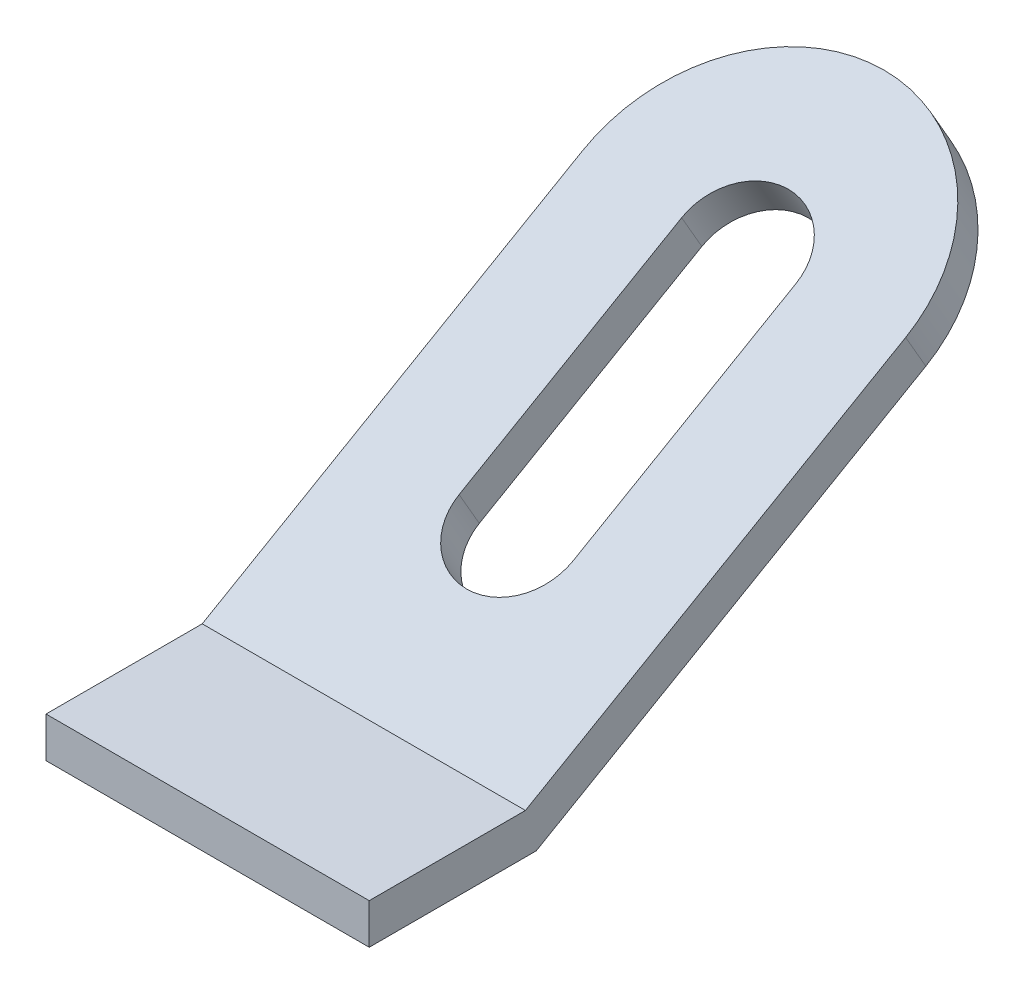
ISO-10303-21;
HEADER;
FILE_DESCRIPTION(('STEP AP214'),'2;1');
FILE_NAME('part.step','',(''),(''),'','','');
FILE_SCHEMA(('AUTOMOTIVE_DESIGN { 1 0 10303 214 1 1 1 1 }'));
ENDSEC;
DATA;
#1=APPLICATION_CONTEXT('core data for automotive mechanical design processes');
#2=APPLICATION_PROTOCOL_DEFINITION('international standard','automotive_design',2000,#1);
#3=PRODUCT_CONTEXT('',#1,'mechanical');
#4=PRODUCT('Part','Part','',(#3));
#5=PRODUCT_RELATED_PRODUCT_CATEGORY('part','',(#4));
#6=PRODUCT_DEFINITION_FORMATION('','',#4);
#7=PRODUCT_DEFINITION_CONTEXT('part definition',#1,'design');
#8=PRODUCT_DEFINITION('design','',#6,#7);
#9=PRODUCT_DEFINITION_SHAPE('','',#8);
#10=(LENGTH_UNIT() NAMED_UNIT(*) SI_UNIT(.MILLI.,.METRE.));
#11=(NAMED_UNIT(*) PLANE_ANGLE_UNIT() SI_UNIT($,.RADIAN.));
#12=(NAMED_UNIT(*) SI_UNIT($,.STERADIAN.) SOLID_ANGLE_UNIT());
#13=UNCERTAINTY_MEASURE_WITH_UNIT(LENGTH_MEASURE(1.E-05),#10,'distance_accuracy_value','');
#14=(GEOMETRIC_REPRESENTATION_CONTEXT(3) GLOBAL_UNCERTAINTY_ASSIGNED_CONTEXT((#13)) GLOBAL_UNIT_ASSIGNED_CONTEXT((#10,
#11,#12)) REPRESENTATION_CONTEXT('',''));
#15=CARTESIAN_POINT('',(0.,0.,0.));
#16=DIRECTION('',(0.,0.,1.));
#17=DIRECTION('',(1.,0.,0.));
#18=AXIS2_PLACEMENT_3D('',#15,#16,#17);
#19=CARTESIAN_POINT('',(2.,1.76674682452695,-3.31009526419165));
#20=DIRECTION('',(0.,0.866025403784439,0.5));
#21=DIRECTION('',(0.,-0.5,0.866025403784439));
#22=AXIS2_PLACEMENT_3D('',#19,#20,#21);
#23=PLANE('',#22);
#24=DIRECTION('',(0.,0.5,-0.866025403784439));
#25=VECTOR('',#24,1.);
#26=CARTESIAN_POINT('',(0.646584863990501,0.452920877533672,-1.034481971697));
#27=LINE('',#26,#25);
#28=CARTESIAN_POINT('',(0.646584863990501,0.452920877533672,-1.034481971697));
#29=VERTEX_POINT('',#28);
#30=CARTESIAN_POINT('',(0.646584863990501,1.24794660594162,-2.41150692662403));
#31=VERTEX_POINT('',#30);
#32=EDGE_CURVE('E134',#29,#31,#27,.T.);
#33=ORIENTED_EDGE('',*,*,#32,.F.);
#34=CARTESIAN_POINT('',(0.999999999999999,0.452920877533672,-1.034481971697));
#35=DIRECTION('',(0.,0.866025403784439,0.5));
#36=DIRECTION('',(0.,-0.5,0.866025403784439));
#37=AXIS2_PLACEMENT_3D('',#34,#35,#36);
#38=CIRCLE('',#37,0.353415136009498);
#39=CARTESIAN_POINT('',(1.3534151360095,0.452920877533672,-1.034481971697));
#40=VERTEX_POINT('',#39);
#41=EDGE_CURVE('E118',#40,#29,#38,.F.);
#42=ORIENTED_EDGE('',*,*,#41,.F.);
#43=DIRECTION('',(0.,-0.5,0.866025403784439));
#44=VECTOR('',#43,1.);
#45=CARTESIAN_POINT('',(1.3534151360095,0.452920877533672,-1.034481971697));
#46=LINE('',#45,#44);
#47=CARTESIAN_POINT('',(1.3534151360095,1.24794660594162,-2.41150692662403));
#48=VERTEX_POINT('',#47);
#49=EDGE_CURVE('E127',#48,#40,#46,.T.);
#50=ORIENTED_EDGE('',*,*,#49,.F.);
#51=CARTESIAN_POINT('',(0.999999999999997,1.24794660594162,-2.41150692662403));
#52=DIRECTION('',(0.,0.866025403784439,0.5));
#53=DIRECTION('',(0.,-0.5,0.866025403784439));
#54=AXIS2_PLACEMENT_3D('',#51,#52,#53);
#55=CIRCLE('',#54,0.353415136009498);
#56=EDGE_CURVE('E49',#31,#48,#55,.F.);
#57=ORIENTED_EDGE('',*,*,#56,.F.);
#58=EDGE_LOOP('',(#33,#42,#50,#57));
#59=FACE_BOUND('',#58,.T.);
#60=DIRECTION('',(0.,0.5,-0.866025403784439));
#61=VECTOR('',#60,1.);
#62=CARTESIAN_POINT('',(0.,1.76674682452695,-3.31009526419165));
#63=LINE('',#62,#61);
#64=CARTESIAN_POINT('',(0.,-0.125,-0.0334936490538902));
#65=VERTEX_POINT('',#64);
#66=CARTESIAN_POINT('',(0.,1.26674682452695,-2.44406986040721));
#67=VERTEX_POINT('',#66);
#68=EDGE_CURVE('E164',#65,#67,#63,.T.);
#69=ORIENTED_EDGE('',*,*,#68,.T.);
#70=CARTESIAN_POINT('',(1.,1.26674682452695,-2.44406986040721));
#71=DIRECTION('',(0.,0.866025403784439,0.5));
#72=DIRECTION('',(0.,-0.5,0.866025403784439));
#73=AXIS2_PLACEMENT_3D('',#70,#71,#72);
#74=CIRCLE('',#73,1.);
#75=CARTESIAN_POINT('',(1.,1.76674682452695,-3.31009526419165));
#76=VERTEX_POINT('',#75);
#77=EDGE_CURVE('E42',#67,#76,#74,.F.);
#78=ORIENTED_EDGE('',*,*,#77,.T.);
#79=CARTESIAN_POINT('',(1.,1.26674682452695,-2.44406986040721));
#80=DIRECTION('',(0.,0.866025403784439,0.5));
#81=DIRECTION('',(0.,-0.5,0.866025403784439));
#82=AXIS2_PLACEMENT_3D('',#79,#80,#81);
#83=CIRCLE('',#82,1.);
#84=CARTESIAN_POINT('',(2.,1.26674682452695,-2.44406986040721));
#85=VERTEX_POINT('',#84);
#86=EDGE_CURVE('E192',#76,#85,#83,.F.);
#87=ORIENTED_EDGE('',*,*,#86,.T.);
#88=DIRECTION('',(0.,0.5,-0.866025403784439));
#89=VECTOR('',#88,1.);
#90=CARTESIAN_POINT('',(2.,1.76674682452695,-3.31009526419165));
#91=LINE('',#90,#89);
#92=CARTESIAN_POINT('',(2.,-0.125,-0.0334936490538902));
#93=VERTEX_POINT('',#92);
#94=EDGE_CURVE('E151',#93,#85,#91,.T.);
#95=ORIENTED_EDGE('',*,*,#94,.F.);
#96=DIRECTION('',(-1.,0.,0.));
#97=VECTOR('',#96,1.);
#98=CARTESIAN_POINT('',(2.,-0.125,-0.0334936490538902));
#99=LINE('',#98,#97);
#100=EDGE_CURVE('E163',#93,#65,#99,.T.);
#101=ORIENTED_EDGE('',*,*,#100,.T.);
#102=EDGE_LOOP('',(#69,#78,#87,#95,#101));
#103=FACE_BOUND('',#102,.T.);
#104=ADVANCED_FACE('F33',(#59,#103),#23,.F.);
#105=CARTESIAN_POINT('',(2.,0.125,0.0334936490538904));
#106=DIRECTION('',(0.,-0.866025403784439,-0.5));
#107=DIRECTION('',(0.,0.5,-0.866025403784439));
#108=AXIS2_PLACEMENT_3D('',#105,#106,#107);
#109=PLANE('',#108);
#110=DIRECTION('',(0.,0.5,-0.866025403784439));
#111=VECTOR('',#110,1.);
#112=CARTESIAN_POINT('',(1.3534151360095,0.669427228479781,-0.909481971697001));
#113=LINE('',#112,#111);
#114=CARTESIAN_POINT('',(1.3534151360095,0.669427228479782,-0.909481971697001));
#115=VERTEX_POINT('',#114);
#116=CARTESIAN_POINT('',(1.35341513600949,1.46445295688773,-2.28650692662403));
#117=VERTEX_POINT('',#116);
#118=EDGE_CURVE('E136',#115,#117,#113,.T.);
#119=ORIENTED_EDGE('',*,*,#118,.F.);
#120=CARTESIAN_POINT('',(0.999999999999999,0.669427228479781,-0.909481971697001));
#121=DIRECTION('',(0.,0.866025403784439,0.5));
#122=DIRECTION('',(0.,-0.5,0.866025403784439));
#123=AXIS2_PLACEMENT_3D('',#120,#121,#122);
#124=CIRCLE('',#123,0.353415136009498);
#125=CARTESIAN_POINT('',(0.646584863990501,0.669427228479781,-0.909481971697));
#126=VERTEX_POINT('',#125);
#127=EDGE_CURVE('E57',#126,#115,#124,.T.);
#128=ORIENTED_EDGE('',*,*,#127,.F.);
#129=DIRECTION('',(0.,-0.5,0.866025403784439));
#130=VECTOR('',#129,1.);
#131=CARTESIAN_POINT('',(0.646584863990501,0.669427228479781,-0.909481971697));
#132=LINE('',#131,#130);
#133=CARTESIAN_POINT('',(0.646584863990501,1.46445295688773,-2.28650692662403));
#134=VERTEX_POINT('',#133);
#135=EDGE_CURVE('E124',#134,#126,#132,.T.);
#136=ORIENTED_EDGE('',*,*,#135,.F.);
#137=CARTESIAN_POINT('',(0.999999999999997,1.46445295688773,-2.28650692662403));
#138=DIRECTION('',(0.,0.866025403784439,0.5));
#139=DIRECTION('',(0.,-0.5,0.866025403784439));
#140=AXIS2_PLACEMENT_3D('',#137,#138,#139);
#141=CIRCLE('',#140,0.353415136009498);
#142=EDGE_CURVE('E142',#117,#134,#141,.T.);
#143=ORIENTED_EDGE('',*,*,#142,.F.);
#144=EDGE_LOOP('',(#119,#128,#136,#143));
#145=FACE_BOUND('',#144,.T.);
#146=CARTESIAN_POINT('',(1.,1.48325317547306,-2.31906986040721));
#147=DIRECTION('',(0.,-0.866025403784439,-0.5));
#148=DIRECTION('',(0.,0.5,-0.866025403784439));
#149=AXIS2_PLACEMENT_3D('',#146,#147,#148);
#150=CIRCLE('',#149,1.);
#151=CARTESIAN_POINT('',(2.,1.48325317547306,-2.31906986040721));
#152=VERTEX_POINT('',#151);
#153=CARTESIAN_POINT('',(1.,1.98325317547306,-3.18509526419165));
#154=VERTEX_POINT('',#153);
#155=EDGE_CURVE('E185',#152,#154,#150,.F.);
#156=ORIENTED_EDGE('',*,*,#155,.T.);
#157=CARTESIAN_POINT('',(1.,1.48325317547306,-2.31906986040721));
#158=DIRECTION('',(0.,-0.866025403784439,-0.5));
#159=DIRECTION('',(0.,0.5,-0.866025403784439));
#160=AXIS2_PLACEMENT_3D('',#157,#158,#159);
#161=CIRCLE('',#160,1.);
#162=CARTESIAN_POINT('',(0.,1.48325317547306,-2.31906986040721));
#163=VERTEX_POINT('',#162);
#164=EDGE_CURVE('E187',#154,#163,#161,.F.);
#165=ORIENTED_EDGE('',*,*,#164,.T.);
#166=DIRECTION('',(0.,-0.5,0.866025403784439));
#167=VECTOR('',#166,1.);
#168=CARTESIAN_POINT('',(0.,0.125,0.0334936490538904));
#169=LINE('',#168,#167);
#170=CARTESIAN_POINT('',(0.,0.125,0.0334936490538904));
#171=VERTEX_POINT('',#170);
#172=EDGE_CURVE('E167',#163,#171,#169,.T.);
#173=ORIENTED_EDGE('',*,*,#172,.T.);
#174=DIRECTION('',(-1.,0.,0.));
#175=VECTOR('',#174,1.);
#176=CARTESIAN_POINT('',(2.,0.125,0.0334936490538904));
#177=LINE('',#176,#175);
#178=CARTESIAN_POINT('',(2.,0.125,0.0334936490538904));
#179=VERTEX_POINT('',#178);
#180=EDGE_CURVE('E182',#179,#171,#177,.T.);
#181=ORIENTED_EDGE('',*,*,#180,.F.);
#182=DIRECTION('',(0.,-0.5,0.866025403784439));
#183=VECTOR('',#182,1.);
#184=CARTESIAN_POINT('',(2.,0.125,0.0334936490538904));
#185=LINE('',#184,#183);
#186=EDGE_CURVE('E154',#152,#179,#185,.T.);
#187=ORIENTED_EDGE('',*,*,#186,.F.);
#188=EDGE_LOOP('',(#156,#165,#173,#181,#187));
#189=FACE_BOUND('',#188,.T.);
#190=ADVANCED_FACE('F208',(#145,#189),#109,.F.);
#191=CARTESIAN_POINT('',(2.,0.125,1.));
#192=DIRECTION('',(0.,-1.,0.));
#193=DIRECTION('',(0.,0.,-1.));
#194=AXIS2_PLACEMENT_3D('',#191,#192,#193);
#195=PLANE('',#194);
#196=DIRECTION('',(0.,0.,1.));
#197=VECTOR('',#196,1.);
#198=CARTESIAN_POINT('',(0.,0.125,1.));
#199=LINE('',#198,#197);
#200=CARTESIAN_POINT('',(0.,0.125,1.));
#201=VERTEX_POINT('',#200);
#202=EDGE_CURVE('E169',#171,#201,#199,.T.);
#203=ORIENTED_EDGE('',*,*,#202,.T.);
#204=DIRECTION('',(-1.,0.,0.));
#205=VECTOR('',#204,1.);
#206=CARTESIAN_POINT('',(2.,0.125,1.));
#207=LINE('',#206,#205);
#208=CARTESIAN_POINT('',(2.,0.125,1.));
#209=VERTEX_POINT('',#208);
#210=EDGE_CURVE('E179',#209,#201,#207,.T.);
#211=ORIENTED_EDGE('',*,*,#210,.F.);
#212=DIRECTION('',(0.,0.,1.));
#213=VECTOR('',#212,1.);
#214=CARTESIAN_POINT('',(2.,0.125,1.));
#215=LINE('',#214,#213);
#216=EDGE_CURVE('E157',#179,#209,#215,.T.);
#217=ORIENTED_EDGE('',*,*,#216,.F.);
#218=ORIENTED_EDGE('',*,*,#180,.T.);
#219=EDGE_LOOP('',(#203,#211,#217,#218));
#220=FACE_BOUND('',#219,.T.);
#221=ADVANCED_FACE('F218',(#220),#195,.F.);
#222=CARTESIAN_POINT('',(2.,0.125,1.));
#223=DIRECTION('',(0.,0.,-1.));
#224=DIRECTION('',(-1.,0.,0.));
#225=AXIS2_PLACEMENT_3D('',#222,#223,#224);
#226=PLANE('',#225);
#227=DIRECTION('',(0.,-1.,0.));
#228=VECTOR('',#227,1.);
#229=CARTESIAN_POINT('',(0.,0.125,1.));
#230=LINE('',#229,#228);
#231=CARTESIAN_POINT('',(0.,-0.125,1.));
#232=VERTEX_POINT('',#231);
#233=EDGE_CURVE('E171',#201,#232,#230,.T.);
#234=ORIENTED_EDGE('',*,*,#233,.T.);
#235=DIRECTION('',(-1.,0.,0.));
#236=VECTOR('',#235,1.);
#237=CARTESIAN_POINT('',(2.,-0.125,1.));
#238=LINE('',#237,#236);
#239=CARTESIAN_POINT('',(2.,-0.125,1.));
#240=VERTEX_POINT('',#239);
#241=EDGE_CURVE('E176',#240,#232,#238,.T.);
#242=ORIENTED_EDGE('',*,*,#241,.F.);
#243=DIRECTION('',(0.,-1.,0.));
#244=VECTOR('',#243,1.);
#245=CARTESIAN_POINT('',(2.,0.125,1.));
#246=LINE('',#245,#244);
#247=EDGE_CURVE('E159',#209,#240,#246,.T.);
#248=ORIENTED_EDGE('',*,*,#247,.F.);
#249=ORIENTED_EDGE('',*,*,#210,.T.);
#250=EDGE_LOOP('',(#234,#242,#248,#249));
#251=FACE_BOUND('',#250,.T.);
#252=ADVANCED_FACE('F222',(#251),#226,.F.);
#253=CARTESIAN_POINT('',(2.,-0.125,-0.0334936490538902));
#254=DIRECTION('',(0.,1.,0.));
#255=DIRECTION('',(0.,0.,1.));
#256=AXIS2_PLACEMENT_3D('',#253,#254,#255);
#257=PLANE('',#256);
#258=DIRECTION('',(0.,0.,-1.));
#259=VECTOR('',#258,1.);
#260=CARTESIAN_POINT('',(0.,-0.125,-0.0334936490538902));
#261=LINE('',#260,#259);
#262=EDGE_CURVE('E155',#232,#65,#261,.T.);
#263=ORIENTED_EDGE('',*,*,#262,.T.);
#264=ORIENTED_EDGE('',*,*,#100,.F.);
#265=DIRECTION('',(0.,0.,-1.));
#266=VECTOR('',#265,1.);
#267=CARTESIAN_POINT('',(2.,-0.125,-0.0334936490538902));
#268=LINE('',#267,#266);
#269=EDGE_CURVE('E161',#240,#93,#268,.T.);
#270=ORIENTED_EDGE('',*,*,#269,.F.);
#271=ORIENTED_EDGE('',*,*,#241,.T.);
#272=EDGE_LOOP('',(#263,#264,#270,#271));
#273=FACE_BOUND('',#272,.T.);
#274=ADVANCED_FACE('F229',(#273),#257,.F.);
#275=CARTESIAN_POINT('',(2.,0.,0.));
#276=DIRECTION('',(-1.,0.,0.));
#277=DIRECTION('',(0.,0.,1.));
#278=AXIS2_PLACEMENT_3D('',#275,#276,#277);
#279=PLANE('',#278);
#280=ORIENTED_EDGE('',*,*,#94,.T.);
#281=DIRECTION('',(0.,0.866025403784438,0.5));
#282=VECTOR('',#281,1.);
#283=CARTESIAN_POINT('',(2.,1.375,-2.38156986040721));
#284=LINE('',#283,#282);
#285=EDGE_CURVE('E11',#85,#152,#284,.T.);
#286=ORIENTED_EDGE('',*,*,#285,.T.);
#287=ORIENTED_EDGE('',*,*,#186,.T.);
#288=ORIENTED_EDGE('',*,*,#216,.T.);
#289=ORIENTED_EDGE('',*,*,#247,.T.);
#290=ORIENTED_EDGE('',*,*,#269,.T.);
#291=EDGE_LOOP('',(#280,#286,#287,#288,#289,#290));
#292=FACE_BOUND('',#291,.T.);
#293=ADVANCED_FACE('F226',(#292),#279,.F.);
#294=CARTESIAN_POINT('',(0.,0.,0.));
#295=DIRECTION('',(-1.,0.,0.));
#296=DIRECTION('',(0.,0.,1.));
#297=AXIS2_PLACEMENT_3D('',#294,#295,#296);
#298=PLANE('',#297);
#299=ORIENTED_EDGE('',*,*,#172,.F.);
#300=DIRECTION('',(0.,0.866025403784438,0.5));
#301=VECTOR('',#300,1.);
#302=CARTESIAN_POINT('',(0.,1.26674682452695,-2.44406986040721));
#303=LINE('',#302,#301);
#304=EDGE_CURVE('E189',#163,#67,#303,.F.);
#305=ORIENTED_EDGE('',*,*,#304,.T.);
#306=ORIENTED_EDGE('',*,*,#68,.F.);
#307=ORIENTED_EDGE('',*,*,#262,.F.);
#308=ORIENTED_EDGE('',*,*,#233,.F.);
#309=ORIENTED_EDGE('',*,*,#202,.F.);
#310=EDGE_LOOP('',(#299,#305,#306,#307,#308,#309));
#311=FACE_BOUND('',#310,.T.);
#312=ADVANCED_FACE('F213',(#311),#298,.T.);
#313=CARTESIAN_POINT('',(1.,1.375,-2.38156986040721));
#314=DIRECTION('',(0.,0.866025403784438,0.5));
#315=DIRECTION('',(0.,-0.5,0.866025403784438));
#316=AXIS2_PLACEMENT_3D('',#313,#314,#315);
#317=CYLINDRICAL_SURFACE('',#316,1.);
#318=ORIENTED_EDGE('',*,*,#285,.F.);
#319=ORIENTED_EDGE('',*,*,#86,.F.);
#320=DIRECTION('',(0.,0.866025403784438,0.5));
#321=VECTOR('',#320,1.);
#322=CARTESIAN_POINT('',(1.,1.76674682452695,-3.31009526419165));
#323=LINE('',#322,#321);
#324=EDGE_CURVE('E37',#154,#76,#323,.F.);
#325=ORIENTED_EDGE('',*,*,#324,.F.);
#326=ORIENTED_EDGE('',*,*,#155,.F.);
#327=EDGE_LOOP('',(#318,#319,#325,#326));
#328=FACE_BOUND('',#327,.T.);
#329=ADVANCED_FACE('F35',(#328),#317,.T.);
#330=CARTESIAN_POINT('',(1.,1.26674682452695,-2.44406986040721));
#331=DIRECTION('',(0.,-0.866025403784438,-0.5));
#332=DIRECTION('',(0.,0.5,-0.866025403784438));
#333=AXIS2_PLACEMENT_3D('',#330,#331,#332);
#334=CYLINDRICAL_SURFACE('',#333,1.);
#335=ORIENTED_EDGE('',*,*,#77,.F.);
#336=ORIENTED_EDGE('',*,*,#304,.F.);
#337=ORIENTED_EDGE('',*,*,#164,.F.);
#338=ORIENTED_EDGE('',*,*,#324,.T.);
#339=EDGE_LOOP('',(#335,#336,#337,#338));
#340=FACE_BOUND('',#339,.T.);
#341=ADVANCED_FACE('F205',(#340),#334,.T.);
#342=CARTESIAN_POINT('',(0.999999999999999,-0.967072253563429,-1.85431538818333));
#343=DIRECTION('',(0.,0.866025403784439,0.5));
#344=DIRECTION('',(0.,-0.5,0.866025403784439));
#345=AXIS2_PLACEMENT_3D('',#342,#343,#344);
#346=CYLINDRICAL_SURFACE('',#345,0.353415136009498);
#347=ORIENTED_EDGE('',*,*,#41,.T.);
#348=DIRECTION('',(0.,0.866025403784439,0.5));
#349=VECTOR('',#348,1.);
#350=CARTESIAN_POINT('',(0.646584863990501,-0.96707225356343,-1.85431538818333));
#351=LINE('',#350,#349);
#352=EDGE_CURVE('E130',#29,#126,#351,.T.);
#353=ORIENTED_EDGE('',*,*,#352,.T.);
#354=ORIENTED_EDGE('',*,*,#127,.T.);
#355=DIRECTION('',(0.,0.866025403784439,0.5));
#356=VECTOR('',#355,1.);
#357=CARTESIAN_POINT('',(1.3534151360095,-0.967072253563429,-1.85431538818333));
#358=LINE('',#357,#356);
#359=EDGE_CURVE('E114',#40,#115,#358,.T.);
#360=ORIENTED_EDGE('',*,*,#359,.F.);
#361=EDGE_LOOP('',(#347,#353,#354,#360));
#362=FACE_BOUND('',#361,.T.);
#363=ADVANCED_FACE('F116',(#362),#346,.F.);
#364=CARTESIAN_POINT('',(0.646584863990501,-0.96707225356343,-1.85431538818333));
#365=DIRECTION('',(-1.,0.,0.));
#366=DIRECTION('',(0.,0.,1.));
#367=AXIS2_PLACEMENT_3D('',#364,#365,#366);
#368=PLANE('',#367);
#369=ORIENTED_EDGE('',*,*,#32,.T.);
#370=DIRECTION('',(0.,0.866025403784439,0.5));
#371=VECTOR('',#370,1.);
#372=CARTESIAN_POINT('',(0.646584863990501,-0.172046525155477,-3.23134034311036));
#373=LINE('',#372,#371);
#374=EDGE_CURVE('E148',#31,#134,#373,.T.);
#375=ORIENTED_EDGE('',*,*,#374,.T.);
#376=ORIENTED_EDGE('',*,*,#135,.T.);
#377=ORIENTED_EDGE('',*,*,#352,.F.);
#378=EDGE_LOOP('',(#369,#375,#376,#377));
#379=FACE_BOUND('',#378,.T.);
#380=ADVANCED_FACE('F252',(#379),#368,.F.);
#381=CARTESIAN_POINT('',(0.999999999999997,-0.172046525155477,-3.23134034311036));
#382=DIRECTION('',(0.,0.866025403784439,0.5));
#383=DIRECTION('',(0.,-0.5,0.866025403784439));
#384=AXIS2_PLACEMENT_3D('',#381,#382,#383);
#385=CYLINDRICAL_SURFACE('',#384,0.353415136009498);
#386=ORIENTED_EDGE('',*,*,#56,.T.);
#387=DIRECTION('',(0.,0.866025403784439,0.5));
#388=VECTOR('',#387,1.);
#389=CARTESIAN_POINT('',(1.35341513600949,-0.172046525155477,-3.23134034311036));
#390=LINE('',#389,#388);
#391=EDGE_CURVE('E123',#48,#117,#390,.T.);
#392=ORIENTED_EDGE('',*,*,#391,.T.);
#393=ORIENTED_EDGE('',*,*,#142,.T.);
#394=ORIENTED_EDGE('',*,*,#374,.F.);
#395=EDGE_LOOP('',(#386,#392,#393,#394));
#396=FACE_BOUND('',#395,.T.);
#397=ADVANCED_FACE('F262',(#396),#385,.F.);
#398=CARTESIAN_POINT('',(1.3534151360095,-0.967072253563429,-1.85431538818333));
#399=DIRECTION('',(1.,0.,0.));
#400=DIRECTION('',(0.,0.,-1.));
#401=AXIS2_PLACEMENT_3D('',#398,#399,#400);
#402=PLANE('',#401);
#403=ORIENTED_EDGE('',*,*,#49,.T.);
#404=ORIENTED_EDGE('',*,*,#359,.T.);
#405=ORIENTED_EDGE('',*,*,#118,.T.);
#406=ORIENTED_EDGE('',*,*,#391,.F.);
#407=EDGE_LOOP('',(#403,#404,#405,#406));
#408=FACE_BOUND('',#407,.T.);
#409=ADVANCED_FACE('F128',(#408),#402,.F.);
#410=CLOSED_SHELL('',(#104,#190,#221,#252,#274,#293,#312,#329,#341,#363,#380,#397,#409));
#411=MANIFOLD_SOLID_BREP('B2',#410);
#412=ADVANCED_BREP_SHAPE_REPRESENTATION('',(#18,#411),#14);
#413=SHAPE_DEFINITION_REPRESENTATION(#9,#412);
ENDSEC;
END-ISO-10303-21;
